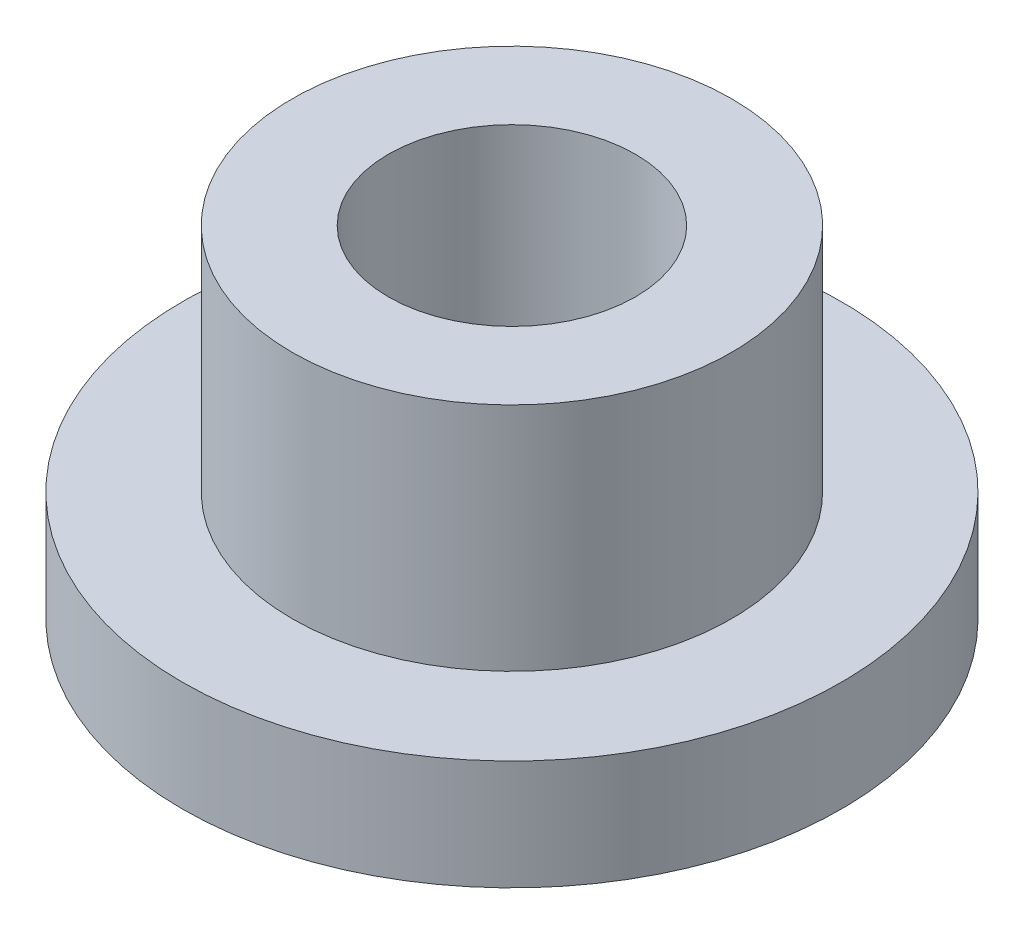
ISO-10303-21;
HEADER;
FILE_DESCRIPTION(('STEP AP214'),'2;1');
FILE_NAME('part.step','',(''),(''),'','','');
FILE_SCHEMA(('AUTOMOTIVE_DESIGN { 1 0 10303 214 1 1 1 1 }'));
ENDSEC;
DATA;
#1=APPLICATION_CONTEXT('core data for automotive mechanical design processes');
#2=APPLICATION_PROTOCOL_DEFINITION('international standard','automotive_design',2000,#1);
#3=PRODUCT_CONTEXT('',#1,'mechanical');
#4=PRODUCT('Part','Part','',(#3));
#5=PRODUCT_RELATED_PRODUCT_CATEGORY('part','',(#4));
#6=PRODUCT_DEFINITION_FORMATION('','',#4);
#7=PRODUCT_DEFINITION_CONTEXT('part definition',#1,'design');
#8=PRODUCT_DEFINITION('design','',#6,#7);
#9=PRODUCT_DEFINITION_SHAPE('','',#8);
#10=(LENGTH_UNIT() NAMED_UNIT(*) SI_UNIT(.MILLI.,.METRE.));
#11=(NAMED_UNIT(*) PLANE_ANGLE_UNIT() SI_UNIT($,.RADIAN.));
#12=(NAMED_UNIT(*) SI_UNIT($,.STERADIAN.) SOLID_ANGLE_UNIT());
#13=UNCERTAINTY_MEASURE_WITH_UNIT(LENGTH_MEASURE(1.E-05),#10,'distance_accuracy_value','');
#14=(GEOMETRIC_REPRESENTATION_CONTEXT(3) GLOBAL_UNCERTAINTY_ASSIGNED_CONTEXT((#13)) GLOBAL_UNIT_ASSIGNED_CONTEXT((#10,
#11,#12)) REPRESENTATION_CONTEXT('',''));
#15=CARTESIAN_POINT('',(0.,0.,0.));
#16=DIRECTION('',(0.,0.,1.));
#17=DIRECTION('',(1.,0.,0.));
#18=AXIS2_PLACEMENT_3D('',#15,#16,#17);
#19=CARTESIAN_POINT('',(0.,2.1,0.));
#20=DIRECTION('',(0.,-1.,0.));
#21=DIRECTION('',(0.,0.,-1.));
#22=AXIS2_PLACEMENT_3D('',#19,#20,#21);
#23=CYLINDRICAL_SURFACE('',#22,2.);
#24=CARTESIAN_POINT('',(0.,2.1,0.));
#25=DIRECTION('',(0.,1.,0.));
#26=DIRECTION('',(0.,0.,1.));
#27=AXIS2_PLACEMENT_3D('',#24,#25,#26);
#28=CIRCLE('',#27,2.);
#29=CARTESIAN_POINT('',(0.,2.1,2.));
#30=VERTEX_POINT('',#29);
#31=EDGE_CURVE('E12',#30,#30,#28,.T.);
#32=ORIENTED_EDGE('',*,*,#31,.F.);
#33=EDGE_LOOP('',(#32));
#34=FACE_BOUND('',#33,.T.);
#35=CARTESIAN_POINT('',(0.,0.,0.));
#36=DIRECTION('',(0.,1.,0.));
#37=DIRECTION('',(0.,0.,1.));
#38=AXIS2_PLACEMENT_3D('',#35,#36,#37);
#39=CIRCLE('',#38,2.);
#40=CARTESIAN_POINT('',(0.,0.,2.));
#41=VERTEX_POINT('',#40);
#42=EDGE_CURVE('E64',#41,#41,#39,.T.);
#43=ORIENTED_EDGE('',*,*,#42,.T.);
#44=EDGE_LOOP('',(#43));
#45=FACE_BOUND('',#44,.T.);
#46=ADVANCED_FACE('F56',(#34,#45),#23,.T.);
#47=CARTESIAN_POINT('',(0.,2.1,0.));
#48=DIRECTION('',(0.,1.,0.));
#49=DIRECTION('',(0.,0.,1.));
#50=AXIS2_PLACEMENT_3D('',#47,#48,#49);
#51=PLANE('',#50);
#52=CARTESIAN_POINT('',(0.,2.1,0.));
#53=DIRECTION('',(0.,1.,0.));
#54=DIRECTION('',(0.,0.,1.));
#55=AXIS2_PLACEMENT_3D('',#52,#53,#54);
#56=CIRCLE('',#55,1.125);
#57=CARTESIAN_POINT('',(0.,2.1,1.125));
#58=VERTEX_POINT('',#57);
#59=EDGE_CURVE('E136',#58,#58,#56,.T.);
#60=ORIENTED_EDGE('',*,*,#59,.F.);
#61=EDGE_LOOP('',(#60));
#62=FACE_BOUND('',#61,.T.);
#63=ORIENTED_EDGE('',*,*,#31,.T.);
#64=EDGE_LOOP('',(#63));
#65=FACE_BOUND('',#64,.T.);
#66=ADVANCED_FACE('F185',(#62,#65),#51,.T.);
#67=CARTESIAN_POINT('',(0.,-1.,0.));
#68=DIRECTION('',(0.,1.,0.));
#69=DIRECTION('',(0.,0.,1.));
#70=AXIS2_PLACEMENT_3D('',#67,#68,#69);
#71=CYLINDRICAL_SURFACE('',#70,3.);
#72=CARTESIAN_POINT('',(0.,-1.,0.));
#73=DIRECTION('',(0.,1.,0.));
#74=DIRECTION('',(0.,0.,1.));
#75=AXIS2_PLACEMENT_3D('',#72,#73,#74);
#76=CIRCLE('',#75,3.);
#77=CARTESIAN_POINT('',(0.,-1.,3.));
#78=VERTEX_POINT('',#77);
#79=EDGE_CURVE('E168',#78,#78,#76,.T.);
#80=ORIENTED_EDGE('',*,*,#79,.T.);
#81=EDGE_LOOP('',(#80));
#82=FACE_BOUND('',#81,.T.);
#83=CARTESIAN_POINT('',(0.,0.,0.));
#84=DIRECTION('',(0.,1.,0.));
#85=DIRECTION('',(0.,0.,1.));
#86=AXIS2_PLACEMENT_3D('',#83,#84,#85);
#87=CIRCLE('',#86,3.);
#88=CARTESIAN_POINT('',(0.,0.,3.));
#89=VERTEX_POINT('',#88);
#90=EDGE_CURVE('E158',#89,#89,#87,.T.);
#91=ORIENTED_EDGE('',*,*,#90,.F.);
#92=EDGE_LOOP('',(#91));
#93=FACE_BOUND('',#92,.T.);
#94=ADVANCED_FACE('F183',(#82,#93),#71,.T.);
#95=CARTESIAN_POINT('',(0.,-1.,0.));
#96=DIRECTION('',(0.,1.,0.));
#97=DIRECTION('',(0.,0.,1.));
#98=AXIS2_PLACEMENT_3D('',#95,#96,#97);
#99=PLANE('',#98);
#100=DIRECTION('',(0.5,0.,-0.866025403784438));
#101=VECTOR('',#100,1.);
#102=CARTESIAN_POINT('',(0.894892917243919,-1.,1.55));
#103=LINE('',#102,#101);
#104=CARTESIAN_POINT('',(0.894892917243919,-1.,1.55));
#105=VERTEX_POINT('',#104);
#106=CARTESIAN_POINT('',(1.78978583448784,-1.,0.));
#107=VERTEX_POINT('',#106);
#108=EDGE_CURVE('E117',#105,#107,#103,.T.);
#109=ORIENTED_EDGE('',*,*,#108,.T.);
#110=DIRECTION('',(-0.5,0.,-0.866025403784438));
#111=VECTOR('',#110,1.);
#112=CARTESIAN_POINT('',(1.78978583448784,-1.,0.));
#113=LINE('',#112,#111);
#114=CARTESIAN_POINT('',(0.894892917243919,-1.,-1.55));
#115=VERTEX_POINT('',#114);
#116=EDGE_CURVE('E112',#107,#115,#113,.T.);
#117=ORIENTED_EDGE('',*,*,#116,.T.);
#118=DIRECTION('',(-1.,0.,0.));
#119=VECTOR('',#118,1.);
#120=CARTESIAN_POINT('',(0.894892917243919,-1.,-1.55));
#121=LINE('',#120,#119);
#122=CARTESIAN_POINT('',(-0.894892917243919,-1.,-1.55));
#123=VERTEX_POINT('',#122);
#124=EDGE_CURVE('E121',#115,#123,#121,.T.);
#125=ORIENTED_EDGE('',*,*,#124,.T.);
#126=DIRECTION('',(-0.5,0.,0.866025403784439));
#127=VECTOR('',#126,1.);
#128=CARTESIAN_POINT('',(-0.894892917243919,-1.,-1.55));
#129=LINE('',#128,#127);
#130=CARTESIAN_POINT('',(-1.78978583448784,-1.,0.));
#131=VERTEX_POINT('',#130);
#132=EDGE_CURVE('E126',#123,#131,#129,.T.);
#133=ORIENTED_EDGE('',*,*,#132,.T.);
#134=DIRECTION('',(0.5,0.,0.866025403784439));
#135=VECTOR('',#134,1.);
#136=CARTESIAN_POINT('',(-1.78978583448784,-1.,0.));
#137=LINE('',#136,#135);
#138=CARTESIAN_POINT('',(-0.894892917243919,-1.,1.55));
#139=VERTEX_POINT('',#138);
#140=EDGE_CURVE('E139',#131,#139,#137,.T.);
#141=ORIENTED_EDGE('',*,*,#140,.T.);
#142=DIRECTION('',(1.,0.,0.));
#143=VECTOR('',#142,1.);
#144=CARTESIAN_POINT('',(-0.894892917243919,-1.,1.55));
#145=LINE('',#144,#143);
#146=EDGE_CURVE('E142',#139,#105,#145,.T.);
#147=ORIENTED_EDGE('',*,*,#146,.T.);
#148=EDGE_LOOP('',(#109,#117,#125,#133,#141,#147));
#149=FACE_BOUND('',#148,.T.);
#150=ORIENTED_EDGE('',*,*,#79,.F.);
#151=EDGE_LOOP('',(#150));
#152=FACE_BOUND('',#151,.T.);
#153=ADVANCED_FACE('F128',(#149,#152),#99,.F.);
#154=CARTESIAN_POINT('',(0.,0.,0.));
#155=DIRECTION('',(0.,1.,0.));
#156=DIRECTION('',(0.,0.,1.));
#157=AXIS2_PLACEMENT_3D('',#154,#155,#156);
#158=PLANE('',#157);
#159=ORIENTED_EDGE('',*,*,#42,.F.);
#160=EDGE_LOOP('',(#159));
#161=FACE_BOUND('',#160,.T.);
#162=ORIENTED_EDGE('',*,*,#90,.T.);
#163=EDGE_LOOP('',(#162));
#164=FACE_BOUND('',#163,.T.);
#165=ADVANCED_FACE('F177',(#161,#164),#158,.T.);
#166=CARTESIAN_POINT('',(1.78978583448784,-1.,0.));
#167=DIRECTION('',(0.866025403784438,0.,-0.5));
#168=DIRECTION('',(-0.5,0.,-0.866025403784438));
#169=AXIS2_PLACEMENT_3D('',#166,#167,#168);
#170=PLANE('',#169);
#171=DIRECTION('',(-0.5,0.,-0.866025403784438));
#172=VECTOR('',#171,1.);
#173=CARTESIAN_POINT('',(1.78978583448784,0.,0.));
#174=LINE('',#173,#172);
#175=CARTESIAN_POINT('',(1.78978583448784,0.,0.));
#176=VERTEX_POINT('',#175);
#177=CARTESIAN_POINT('',(0.894892917243919,0.,-1.55));
#178=VERTEX_POINT('',#177);
#179=EDGE_CURVE('E71',#176,#178,#174,.T.);
#180=ORIENTED_EDGE('',*,*,#179,.T.);
#181=DIRECTION('',(0.,1.,0.));
#182=VECTOR('',#181,1.);
#183=CARTESIAN_POINT('',(0.894892917243919,-1.,-1.55));
#184=LINE('',#183,#182);
#185=EDGE_CURVE('E108',#115,#178,#184,.T.);
#186=ORIENTED_EDGE('',*,*,#185,.F.);
#187=ORIENTED_EDGE('',*,*,#116,.F.);
#188=DIRECTION('',(0.,1.,0.));
#189=VECTOR('',#188,1.);
#190=CARTESIAN_POINT('',(1.78978583448784,-1.,0.));
#191=LINE('',#190,#189);
#192=EDGE_CURVE('E156',#107,#176,#191,.T.);
#193=ORIENTED_EDGE('',*,*,#192,.T.);
#194=EDGE_LOOP('',(#180,#186,#187,#193));
#195=FACE_BOUND('',#194,.T.);
#196=ADVANCED_FACE('F110',(#195),#170,.F.);
#197=CARTESIAN_POINT('',(0.894892917243919,-1.,1.55));
#198=DIRECTION('',(0.866025403784438,0.,0.5));
#199=DIRECTION('',(0.5,0.,-0.866025403784439));
#200=AXIS2_PLACEMENT_3D('',#197,#198,#199);
#201=PLANE('',#200);
#202=DIRECTION('',(0.5,0.,-0.866025403784438));
#203=VECTOR('',#202,1.);
#204=CARTESIAN_POINT('',(0.894892917243919,0.,1.55));
#205=LINE('',#204,#203);
#206=CARTESIAN_POINT('',(0.894892917243919,0.,1.55));
#207=VERTEX_POINT('',#206);
#208=EDGE_CURVE('E76',#207,#176,#205,.T.);
#209=ORIENTED_EDGE('',*,*,#208,.T.);
#210=ORIENTED_EDGE('',*,*,#192,.F.);
#211=ORIENTED_EDGE('',*,*,#108,.F.);
#212=DIRECTION('',(0.,1.,0.));
#213=VECTOR('',#212,1.);
#214=CARTESIAN_POINT('',(0.894892917243919,-1.,1.55));
#215=LINE('',#214,#213);
#216=EDGE_CURVE('E159',#105,#207,#215,.T.);
#217=ORIENTED_EDGE('',*,*,#216,.T.);
#218=EDGE_LOOP('',(#209,#210,#211,#217));
#219=FACE_BOUND('',#218,.T.);
#220=ADVANCED_FACE('F261',(#219),#201,.F.);
#221=CARTESIAN_POINT('',(-0.894892917243919,-1.,1.55));
#222=DIRECTION('',(0.,0.,1.));
#223=DIRECTION('',(1.,0.,0.));
#224=AXIS2_PLACEMENT_3D('',#221,#222,#223);
#225=PLANE('',#224);
#226=DIRECTION('',(1.,0.,0.));
#227=VECTOR('',#226,1.);
#228=CARTESIAN_POINT('',(-0.894892917243919,0.,1.55));
#229=LINE('',#228,#227);
#230=CARTESIAN_POINT('',(-0.89489291724392,0.,1.55));
#231=VERTEX_POINT('',#230);
#232=EDGE_CURVE('E133',#231,#207,#229,.T.);
#233=ORIENTED_EDGE('',*,*,#232,.T.);
#234=ORIENTED_EDGE('',*,*,#216,.F.);
#235=ORIENTED_EDGE('',*,*,#146,.F.);
#236=DIRECTION('',(0.,1.,0.));
#237=VECTOR('',#236,1.);
#238=CARTESIAN_POINT('',(-0.894892917243919,-1.,1.55));
#239=LINE('',#238,#237);
#240=EDGE_CURVE('E161',#139,#231,#239,.T.);
#241=ORIENTED_EDGE('',*,*,#240,.T.);
#242=EDGE_LOOP('',(#233,#234,#235,#241));
#243=FACE_BOUND('',#242,.T.);
#244=ADVANCED_FACE('F252',(#243),#225,.F.);
#245=CARTESIAN_POINT('',(-1.78978583448784,-1.,0.));
#246=DIRECTION('',(-0.866025403784439,0.,0.5));
#247=DIRECTION('',(0.5,0.,0.866025403784439));
#248=AXIS2_PLACEMENT_3D('',#245,#246,#247);
#249=PLANE('',#248);
#250=DIRECTION('',(0.5,0.,0.866025403784439));
#251=VECTOR('',#250,1.);
#252=CARTESIAN_POINT('',(-1.78978583448784,0.,0.));
#253=LINE('',#252,#251);
#254=CARTESIAN_POINT('',(-1.78978583448784,0.,0.));
#255=VERTEX_POINT('',#254);
#256=EDGE_CURVE('E151',#255,#231,#253,.T.);
#257=ORIENTED_EDGE('',*,*,#256,.T.);
#258=ORIENTED_EDGE('',*,*,#240,.F.);
#259=ORIENTED_EDGE('',*,*,#140,.F.);
#260=DIRECTION('',(0.,1.,0.));
#261=VECTOR('',#260,1.);
#262=CARTESIAN_POINT('',(-1.78978583448784,-1.,0.));
#263=LINE('',#262,#261);
#264=EDGE_CURVE('E164',#131,#255,#263,.T.);
#265=ORIENTED_EDGE('',*,*,#264,.T.);
#266=EDGE_LOOP('',(#257,#258,#259,#265));
#267=FACE_BOUND('',#266,.T.);
#268=ADVANCED_FACE('F243',(#267),#249,.F.);
#269=CARTESIAN_POINT('',(-0.894892917243919,-1.,-1.55));
#270=DIRECTION('',(-0.866025403784439,0.,-0.5));
#271=DIRECTION('',(-0.5,0.,0.866025403784439));
#272=AXIS2_PLACEMENT_3D('',#269,#270,#271);
#273=PLANE('',#272);
#274=DIRECTION('',(-0.5,0.,0.866025403784439));
#275=VECTOR('',#274,1.);
#276=CARTESIAN_POINT('',(-0.894892917243919,0.,-1.55));
#277=LINE('',#276,#275);
#278=CARTESIAN_POINT('',(-0.894892917243919,0.,-1.55));
#279=VERTEX_POINT('',#278);
#280=EDGE_CURVE('E148',#279,#255,#277,.T.);
#281=ORIENTED_EDGE('',*,*,#280,.T.);
#282=ORIENTED_EDGE('',*,*,#264,.F.);
#283=ORIENTED_EDGE('',*,*,#132,.F.);
#284=DIRECTION('',(0.,1.,0.));
#285=VECTOR('',#284,1.);
#286=CARTESIAN_POINT('',(-0.894892917243919,-1.,-1.55));
#287=LINE('',#286,#285);
#288=EDGE_CURVE('E116',#123,#279,#287,.T.);
#289=ORIENTED_EDGE('',*,*,#288,.T.);
#290=EDGE_LOOP('',(#281,#282,#283,#289));
#291=FACE_BOUND('',#290,.T.);
#292=ADVANCED_FACE('F237',(#291),#273,.F.);
#293=CARTESIAN_POINT('',(0.894892917243919,-1.,-1.55));
#294=DIRECTION('',(0.,0.,-1.));
#295=DIRECTION('',(-1.,0.,0.));
#296=AXIS2_PLACEMENT_3D('',#293,#294,#295);
#297=PLANE('',#296);
#298=DIRECTION('',(-1.,0.,0.));
#299=VECTOR('',#298,1.);
#300=CARTESIAN_POINT('',(0.894892917243919,0.,-1.55));
#301=LINE('',#300,#299);
#302=EDGE_CURVE('E146',#178,#279,#301,.T.);
#303=ORIENTED_EDGE('',*,*,#302,.T.);
#304=ORIENTED_EDGE('',*,*,#288,.F.);
#305=ORIENTED_EDGE('',*,*,#124,.F.);
#306=ORIENTED_EDGE('',*,*,#185,.T.);
#307=EDGE_LOOP('',(#303,#304,#305,#306));
#308=FACE_BOUND('',#307,.T.);
#309=ADVANCED_FACE('F122',(#308),#297,.F.);
#310=CARTESIAN_POINT('',(0.,0.,0.));
#311=DIRECTION('',(0.,1.,0.));
#312=DIRECTION('',(0.,0.,1.));
#313=AXIS2_PLACEMENT_3D('',#310,#311,#312);
#314=PLANE('',#313);
#315=CARTESIAN_POINT('',(0.,0.,0.));
#316=DIRECTION('',(0.,1.,0.));
#317=DIRECTION('',(0.,0.,1.));
#318=AXIS2_PLACEMENT_3D('',#315,#316,#317);
#319=CIRCLE('',#318,1.125);
#320=CARTESIAN_POINT('',(0.,0.,1.125));
#321=VERTEX_POINT('',#320);
#322=EDGE_CURVE('E59',#321,#321,#319,.F.);
#323=ORIENTED_EDGE('',*,*,#322,.F.);
#324=EDGE_LOOP('',(#323));
#325=FACE_BOUND('',#324,.T.);
#326=ORIENTED_EDGE('',*,*,#179,.F.);
#327=ORIENTED_EDGE('',*,*,#208,.F.);
#328=ORIENTED_EDGE('',*,*,#232,.F.);
#329=ORIENTED_EDGE('',*,*,#256,.F.);
#330=ORIENTED_EDGE('',*,*,#280,.F.);
#331=ORIENTED_EDGE('',*,*,#302,.F.);
#332=EDGE_LOOP('',(#326,#327,#328,#329,#330,#331));
#333=FACE_BOUND('',#332,.T.);
#334=ADVANCED_FACE('F216',(#325,#333),#314,.F.);
#335=CARTESIAN_POINT('',(0.,2.1,0.));
#336=DIRECTION('',(0.,-1.,0.));
#337=DIRECTION('',(0.,0.,-1.));
#338=AXIS2_PLACEMENT_3D('',#335,#336,#337);
#339=CYLINDRICAL_SURFACE('',#338,1.125);
#340=ORIENTED_EDGE('',*,*,#59,.T.);
#341=EDGE_LOOP('',(#340));
#342=FACE_BOUND('',#341,.T.);
#343=ORIENTED_EDGE('',*,*,#322,.T.);
#344=EDGE_LOOP('',(#343));
#345=FACE_BOUND('',#344,.T.);
#346=ADVANCED_FACE('F220',(#342,#345),#339,.F.);
#347=CLOSED_SHELL('',(#46,#66,#94,#153,#165,#196,#220,#244,#268,#292,#309,#334,#346));
#348=MANIFOLD_SOLID_BREP('B2',#347);
#349=ADVANCED_BREP_SHAPE_REPRESENTATION('',(#18,#348),#14);
#350=SHAPE_DEFINITION_REPRESENTATION(#9,#349);
ENDSEC;
END-ISO-10303-21;
